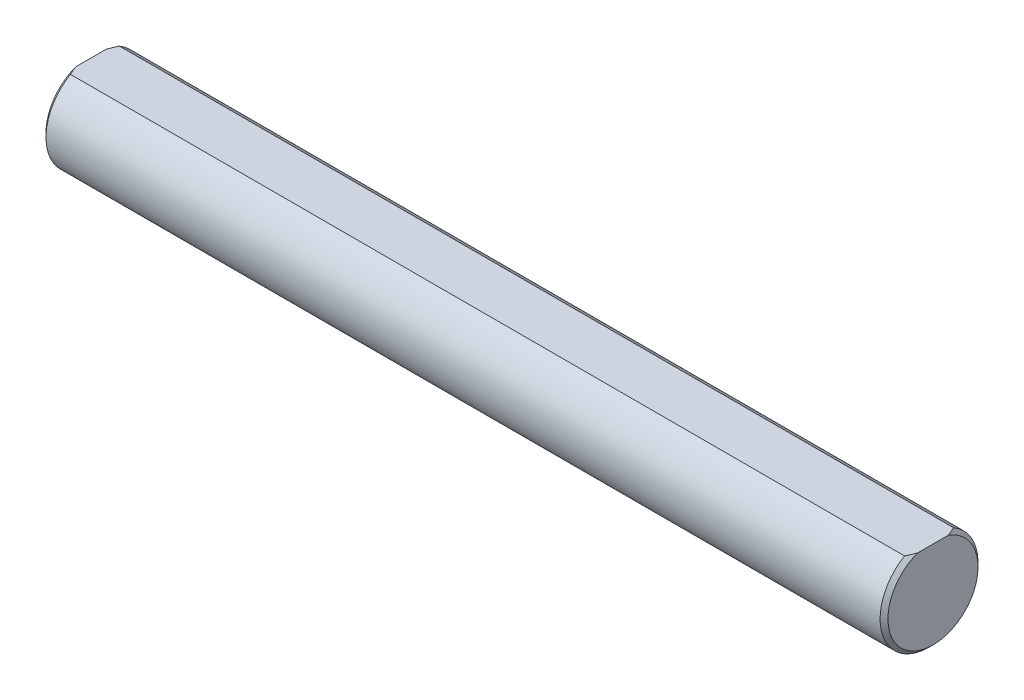
ISO-10303-21;
HEADER;
FILE_DESCRIPTION(('STEP AP214'),'2;1');
FILE_NAME('part.step','',(''),(''),'','','');
FILE_SCHEMA(('AUTOMOTIVE_DESIGN { 1 0 10303 214 1 1 1 1 }'));
ENDSEC;
DATA;
#1=APPLICATION_CONTEXT('core data for automotive mechanical design processes');
#2=APPLICATION_PROTOCOL_DEFINITION('international standard','automotive_design',2000,#1);
#3=PRODUCT_CONTEXT('',#1,'mechanical');
#4=PRODUCT('Part','Part','',(#3));
#5=PRODUCT_RELATED_PRODUCT_CATEGORY('part','',(#4));
#6=PRODUCT_DEFINITION_FORMATION('','',#4);
#7=PRODUCT_DEFINITION_CONTEXT('part definition',#1,'design');
#8=PRODUCT_DEFINITION('design','',#6,#7);
#9=PRODUCT_DEFINITION_SHAPE('','',#8);
#10=(LENGTH_UNIT() NAMED_UNIT(*) SI_UNIT(.MILLI.,.METRE.));
#11=(NAMED_UNIT(*) PLANE_ANGLE_UNIT() SI_UNIT($,.RADIAN.));
#12=(NAMED_UNIT(*) SI_UNIT($,.STERADIAN.) SOLID_ANGLE_UNIT());
#13=UNCERTAINTY_MEASURE_WITH_UNIT(LENGTH_MEASURE(1.E-05),#10,'distance_accuracy_value','');
#14=(GEOMETRIC_REPRESENTATION_CONTEXT(3) GLOBAL_UNCERTAINTY_ASSIGNED_CONTEXT((#13)) GLOBAL_UNIT_ASSIGNED_CONTEXT((#10,
#11,#12)) REPRESENTATION_CONTEXT('',''));
#15=CARTESIAN_POINT('',(0.,0.,0.));
#16=DIRECTION('',(0.,0.,1.));
#17=DIRECTION('',(1.,0.,0.));
#18=AXIS2_PLACEMENT_3D('',#15,#16,#17);
#19=CARTESIAN_POINT('',(54.61,0.,0.));
#20=DIRECTION('',(-1.,0.,0.));
#21=DIRECTION('',(0.,0.,1.));
#22=AXIS2_PLACEMENT_3D('',#19,#20,#21);
#23=CYLINDRICAL_SURFACE('',#22,3.175);
#24=CARTESIAN_POINT('',(54.356,0.,0.));
#25=DIRECTION('',(1.,0.,0.));
#26=DIRECTION('',(0.,0.,-1.));
#27=AXIS2_PLACEMENT_3D('',#24,#25,#26);
#28=CIRCLE('',#27,3.175);
#29=CARTESIAN_POINT('',(54.356,2.74963065701559,-1.5875));
#30=VERTEX_POINT('',#29);
#31=CARTESIAN_POINT('',(54.356,2.74963065701559,1.5875));
#32=VERTEX_POINT('',#31);
#33=EDGE_CURVE('E117',#30,#32,#28,.F.);
#34=ORIENTED_EDGE('',*,*,#33,.T.);
#35=DIRECTION('',(1.,0.,0.));
#36=VECTOR('',#35,1.);
#37=CARTESIAN_POINT('',(0.,2.74963065701559,1.5875));
#38=LINE('',#37,#36);
#39=CARTESIAN_POINT('',(0.253999999999997,2.74963065701559,1.5875));
#40=VERTEX_POINT('',#39);
#41=EDGE_CURVE('E113',#40,#32,#38,.T.);
#42=ORIENTED_EDGE('',*,*,#41,.F.);
#43=CARTESIAN_POINT('',(0.253999999999997,0.,0.));
#44=DIRECTION('',(1.,0.,0.));
#45=DIRECTION('',(0.,0.,-1.));
#46=AXIS2_PLACEMENT_3D('',#43,#44,#45);
#47=CIRCLE('',#46,3.175);
#48=CARTESIAN_POINT('',(0.253999999999997,2.74963065701559,-1.5875));
#49=VERTEX_POINT('',#48);
#50=EDGE_CURVE('E121',#40,#49,#47,.T.);
#51=ORIENTED_EDGE('',*,*,#50,.T.);
#52=DIRECTION('',(1.,0.,0.));
#53=VECTOR('',#52,1.);
#54=CARTESIAN_POINT('',(0.,2.74963065701559,-1.5875));
#55=LINE('',#54,#53);
#56=EDGE_CURVE('E103',#49,#30,#55,.T.);
#57=ORIENTED_EDGE('',*,*,#56,.T.);
#58=EDGE_LOOP('',(#34,#42,#51,#57));
#59=FACE_BOUND('',#58,.T.);
#60=ADVANCED_FACE('F53',(#59),#23,.T.);
#61=CARTESIAN_POINT('',(54.61,0.,0.));
#62=DIRECTION('',(1.,0.,0.));
#63=DIRECTION('',(0.,0.,-1.));
#64=AXIS2_PLACEMENT_3D('',#61,#62,#63);
#65=PLANE('',#64);
#66=DIRECTION('',(0.,0.,-1.));
#67=VECTOR('',#66,1.);
#68=CARTESIAN_POINT('',(54.61,2.74963065701559,1.5875));
#69=LINE('',#68,#67);
#70=CARTESIAN_POINT('',(54.61,2.74963065701559,0.985785093212512));
#71=VERTEX_POINT('',#70);
#72=CARTESIAN_POINT('',(54.61,2.74963065701559,-0.985785093212512));
#73=VERTEX_POINT('',#72);
#74=EDGE_CURVE('E114',#71,#73,#69,.T.);
#75=ORIENTED_EDGE('',*,*,#74,.F.);
#76=CARTESIAN_POINT('',(54.61,0.,0.));
#77=DIRECTION('',(1.,0.,0.));
#78=DIRECTION('',(0.,0.,-1.));
#79=AXIS2_PLACEMENT_3D('',#76,#77,#78);
#80=CIRCLE('',#79,2.921);
#81=EDGE_CURVE('E126',#71,#73,#80,.T.);
#82=ORIENTED_EDGE('',*,*,#81,.T.);
#83=EDGE_LOOP('',(#75,#82));
#84=FACE_BOUND('',#83,.T.);
#85=ADVANCED_FACE('F145',(#84),#65,.T.);
#86=CARTESIAN_POINT('',(0.,0.,0.));
#87=DIRECTION('',(1.,0.,0.));
#88=DIRECTION('',(0.,0.,-1.));
#89=AXIS2_PLACEMENT_3D('',#86,#87,#88);
#90=PLANE('',#89);
#91=CARTESIAN_POINT('',(0.,0.,0.));
#92=DIRECTION('',(1.,0.,0.));
#93=DIRECTION('',(0.,0.,-1.));
#94=AXIS2_PLACEMENT_3D('',#91,#92,#93);
#95=CIRCLE('',#94,2.92100000000001);
#96=CARTESIAN_POINT('',(0.,2.74963065701559,-0.985785093212534));
#97=VERTEX_POINT('',#96);
#98=CARTESIAN_POINT('',(0.,2.74963065701559,0.985785093212534));
#99=VERTEX_POINT('',#98);
#100=EDGE_CURVE('E111',#97,#99,#95,.F.);
#101=ORIENTED_EDGE('',*,*,#100,.T.);
#102=DIRECTION('',(0.,0.,-1.));
#103=VECTOR('',#102,1.);
#104=CARTESIAN_POINT('',(0.,2.74963065701559,1.5875));
#105=LINE('',#104,#103);
#106=EDGE_CURVE('E78',#99,#97,#105,.T.);
#107=ORIENTED_EDGE('',*,*,#106,.T.);
#108=EDGE_LOOP('',(#101,#107));
#109=FACE_BOUND('',#108,.T.);
#110=ADVANCED_FACE('F110',(#109),#90,.F.);
#111=CARTESIAN_POINT('',(54.61,0.,0.));
#112=DIRECTION('',(-1.,0.,0.));
#113=DIRECTION('',(0.,0.,1.));
#114=AXIS2_PLACEMENT_3D('',#111,#112,#113);
#115=CONICAL_SURFACE('',#114,2.921,0.78539816339744);
#116=CARTESIAN_POINT('',(54.3556499421324,2.74963065701559,1.5882));
#117=CARTESIAN_POINT('',(54.4101996989638,2.74963065701559,1.47903148983545));
#118=CARTESIAN_POINT('',(54.4615467736488,2.74963065701559,1.36803725312433));
#119=CARTESIAN_POINT('',(54.5555640164845,2.74963065701559,1.14170613856964));
#120=CARTESIAN_POINT('',(54.5981818395588,2.74963065701559,1.02634771127009));
#121=CARTESIAN_POINT('',(54.671188105863,2.74963065701559,0.793732645811749));
#122=CARTESIAN_POINT('',(54.7017601474436,2.74963065701559,0.676535314799152));
#123=CARTESIAN_POINT('',(54.748863762629,2.74963065701559,0.439559207905036));
#124=CARTESIAN_POINT('',(54.7654305251547,2.74963065701559,0.319787681762697));
#125=CARTESIAN_POINT('',(54.7803772767312,2.74963065701559,0.113390763403407));
#126=CARTESIAN_POINT('',(54.7825911723138,2.74963065701559,0.0270323810887822));
#127=CARTESIAN_POINT('',(54.7788706827955,2.74963065701559,-0.145543469555188));
#128=CARTESIAN_POINT('',(54.7729334400268,2.74963065701559,-0.231760877849848));
#129=CARTESIAN_POINT('',(54.753248527632,2.74963065701559,-0.403381872739591));
#130=CARTESIAN_POINT('',(54.7394921121184,2.74963065701559,-0.488784438972637));
#131=CARTESIAN_POINT('',(54.7049240312319,2.74963065701559,-0.658112847485111));
#132=CARTESIAN_POINT('',(54.6841129063332,2.74963065701559,-0.742038802372471));
#133=CARTESIAN_POINT('',(54.62230417238,2.74963065701559,-0.957097052575812));
#134=CARTESIAN_POINT('',(54.5766386107287,2.74963065701559,-1.08689353852327));
#135=CARTESIAN_POINT('',(54.499545010794,2.74963065701559,-1.27774543186102));
#136=CARTESIAN_POINT('',(54.472457262408,2.74963065701559,-1.34063930357722));
#137=CARTESIAN_POINT('',(54.4158118782309,2.74963065701559,-1.46526121960739));
#138=CARTESIAN_POINT('',(54.3862557633007,2.74963065701559,-1.52698995347895));
#139=CARTESIAN_POINT('',(54.3556499421324,2.74963065701559,-1.5882));
#140=B_SPLINE_CURVE_WITH_KNOTS('',3,(#116,#117,#118,#119,#120,#121,#122,#123,#124,#125,#126,
#127,#128,#129,#130,#131,#132,#133,#134,#135,#136,#137,#138,#139),.UNSPECIFIED.,.F.,.F.,(4,2,2,
2,2,2,2,2,2,2,2,4),(0.,0.366369811138809,0.734876090737475,1.09752564771278,1.45926129943161,
1.71805477031436,1.97693899350522,2.236113354854,2.49526786486619,2.90718803562741,
3.11259006926563,3.31786646708284),.UNSPECIFIED.);
#141=EDGE_CURVE('E130',#32,#71,#140,.T.);
#142=ORIENTED_EDGE('',*,*,#141,.F.);
#143=ORIENTED_EDGE('',*,*,#33,.F.);
#144=EDGE_CURVE('E85',#73,#30,#140,.T.);
#145=ORIENTED_EDGE('',*,*,#144,.F.);
#146=ORIENTED_EDGE('',*,*,#81,.F.);
#147=EDGE_LOOP('',(#142,#143,#145,#146));
#148=FACE_BOUND('',#147,.T.);
#149=ADVANCED_FACE('F139',(#148),#115,.T.);
#150=CARTESIAN_POINT('',(0.253999999999997,0.,0.));
#151=DIRECTION('',(1.,0.,0.));
#152=DIRECTION('',(0.,0.,-1.));
#153=AXIS2_PLACEMENT_3D('',#150,#151,#152);
#154=CONICAL_SURFACE('',#153,3.175,0.785398163397439);
#155=CARTESIAN_POINT('',(0.254350057867633,2.74963065701559,-1.5882));
#156=CARTESIAN_POINT('',(0.199800301036166,2.74963065701559,-1.47903148983545));
#157=CARTESIAN_POINT('',(0.14845322635123,2.74963065701559,-1.36803725312433));
#158=CARTESIAN_POINT('',(0.0544359835155404,2.74963065701559,-1.14170613856964));
#159=CARTESIAN_POINT('',(0.0118181604412225,2.74963065701559,-1.02634771127009));
#160=CARTESIAN_POINT('',(-0.0611881058630327,2.74963065701559,-0.793732645811747));
#161=CARTESIAN_POINT('',(-0.0917601474436525,2.74963065701559,-0.676535314799149));
#162=CARTESIAN_POINT('',(-0.138863762628965,2.74963065701559,-0.439559207905032));
#163=CARTESIAN_POINT('',(-0.155430525154703,2.74963065701559,-0.319787681762694));
#164=CARTESIAN_POINT('',(-0.170377276731227,2.74963065701559,-0.113390763403405));
#165=CARTESIAN_POINT('',(-0.172591172313856,2.74963065701559,-0.02703238108878));
#166=CARTESIAN_POINT('',(-0.168870682795501,2.74963065701559,0.14554346955519));
#167=CARTESIAN_POINT('',(-0.162933440026845,2.74963065701559,0.23176087784985));
#168=CARTESIAN_POINT('',(-0.143248527632002,2.74963065701559,0.403381872739592));
#169=CARTESIAN_POINT('',(-0.129492112118376,2.74963065701559,0.488784438972639));
#170=CARTESIAN_POINT('',(-0.0949240312318916,2.74963065701559,0.658112847485112));
#171=CARTESIAN_POINT('',(-0.074112906333237,2.74963065701559,0.742038802372472));
#172=CARTESIAN_POINT('',(-0.0123041723800643,2.74963065701559,0.957097052575812));
#173=CARTESIAN_POINT('',(0.0333613892713366,2.74963065701559,1.08689353852327));
#174=CARTESIAN_POINT('',(0.110454989206001,2.74963065701559,1.27774543186102));
#175=CARTESIAN_POINT('',(0.137542737591996,2.74963065701559,1.34063930357722));
#176=CARTESIAN_POINT('',(0.194188121769084,2.74963065701559,1.46526121960739));
#177=CARTESIAN_POINT('',(0.223744236699278,2.74963065701559,1.52698995347895));
#178=CARTESIAN_POINT('',(0.254350057867633,2.74963065701559,1.5882));
#179=B_SPLINE_CURVE_WITH_KNOTS('',3,(#155,#156,#157,#158,#159,#160,#161,#162,#163,#164,#165,
#166,#167,#168,#169,#170,#171,#172,#173,#174,#175,#176,#177,#178),.UNSPECIFIED.,.F.,.F.,(4,2,2,
2,2,2,2,2,2,2,2,4),(0.,0.366369811138806,0.734876090737476,1.09752564771278,1.45926129943162,
1.71805477031436,1.97693899350522,2.236113354854,2.49526786486619,2.90718803562741,
3.11259006926563,3.31786646708284),.UNSPECIFIED.);
#180=EDGE_CURVE('E11',#49,#97,#179,.T.);
#181=ORIENTED_EDGE('',*,*,#180,.F.);
#182=ORIENTED_EDGE('',*,*,#50,.F.);
#183=EDGE_CURVE('E59',#99,#40,#179,.T.);
#184=ORIENTED_EDGE('',*,*,#183,.F.);
#185=ORIENTED_EDGE('',*,*,#100,.F.);
#186=EDGE_LOOP('',(#181,#182,#184,#185));
#187=FACE_BOUND('',#186,.T.);
#188=ADVANCED_FACE('F56',(#187),#154,.T.);
#189=CARTESIAN_POINT('',(0.,2.74963065701559,1.5875));
#190=DIRECTION('',(0.,-1.,0.));
#191=DIRECTION('',(0.,0.,-1.));
#192=AXIS2_PLACEMENT_3D('',#189,#190,#191);
#193=PLANE('',#192);
#194=ORIENTED_EDGE('',*,*,#141,.T.);
#195=ORIENTED_EDGE('',*,*,#74,.T.);
#196=ORIENTED_EDGE('',*,*,#144,.T.);
#197=ORIENTED_EDGE('',*,*,#56,.F.);
#198=ORIENTED_EDGE('',*,*,#180,.T.);
#199=ORIENTED_EDGE('',*,*,#106,.F.);
#200=ORIENTED_EDGE('',*,*,#183,.T.);
#201=ORIENTED_EDGE('',*,*,#41,.T.);
#202=EDGE_LOOP('',(#194,#195,#196,#197,#198,#199,#200,#201));
#203=FACE_BOUND('',#202,.T.);
#204=ADVANCED_FACE('F102',(#203),#193,.F.);
#205=CLOSED_SHELL('',(#60,#85,#110,#149,#188,#204));
#206=MANIFOLD_SOLID_BREP('B2',#205);
#207=ADVANCED_BREP_SHAPE_REPRESENTATION('',(#18,#206),#14);
#208=SHAPE_DEFINITION_REPRESENTATION(#9,#207);
ENDSEC;
END-ISO-10303-21;
